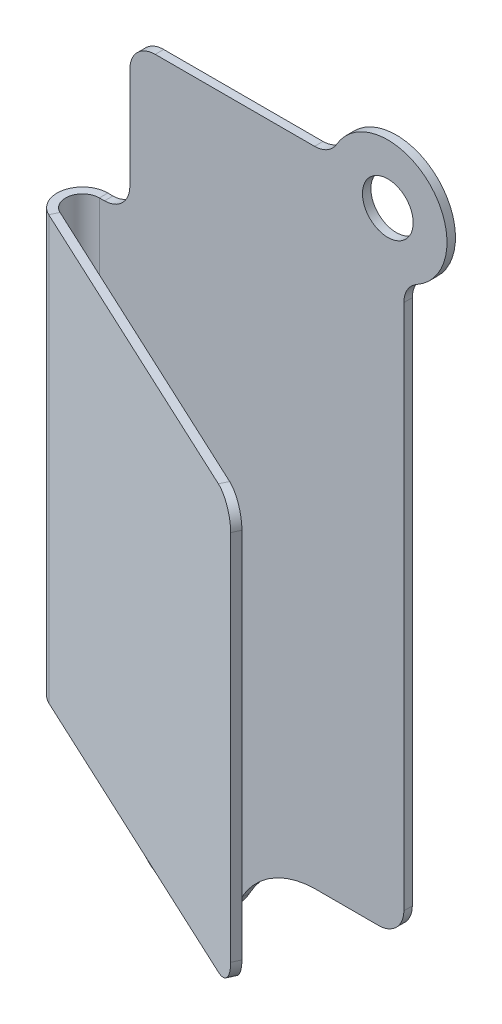
ISO-10303-21;
HEADER;
FILE_DESCRIPTION(('STEP AP214'),'2;1');
FILE_NAME('part.step','',(''),(''),'','','');
FILE_SCHEMA(('AUTOMOTIVE_DESIGN { 1 0 10303 214 1 1 1 1 }'));
ENDSEC;
DATA;
#1=APPLICATION_CONTEXT('core data for automotive mechanical design processes');
#2=APPLICATION_PROTOCOL_DEFINITION('international standard','automotive_design',2000,#1);
#3=PRODUCT_CONTEXT('',#1,'mechanical');
#4=PRODUCT('Part','Part','',(#3));
#5=PRODUCT_RELATED_PRODUCT_CATEGORY('part','',(#4));
#6=PRODUCT_DEFINITION_FORMATION('','',#4);
#7=PRODUCT_DEFINITION_CONTEXT('part definition',#1,'design');
#8=PRODUCT_DEFINITION('design','',#6,#7);
#9=PRODUCT_DEFINITION_SHAPE('','',#8);
#10=(LENGTH_UNIT() NAMED_UNIT(*) SI_UNIT(.MILLI.,.METRE.));
#11=(NAMED_UNIT(*) PLANE_ANGLE_UNIT() SI_UNIT($,.RADIAN.));
#12=(NAMED_UNIT(*) SI_UNIT($,.STERADIAN.) SOLID_ANGLE_UNIT());
#13=UNCERTAINTY_MEASURE_WITH_UNIT(LENGTH_MEASURE(1.E-05),#10,'distance_accuracy_value','');
#14=(GEOMETRIC_REPRESENTATION_CONTEXT(3) GLOBAL_UNCERTAINTY_ASSIGNED_CONTEXT((#13)) GLOBAL_UNIT_ASSIGNED_CONTEXT((#10,
#11,#12)) REPRESENTATION_CONTEXT('',''));
#15=CARTESIAN_POINT('',(0.,0.,0.));
#16=DIRECTION('',(0.,0.,1.));
#17=DIRECTION('',(1.,0.,0.));
#18=AXIS2_PLACEMENT_3D('',#15,#16,#17);
#19=CARTESIAN_POINT('',(23.5,76.,0.));
#20=DIRECTION('',(0.,0.,1.));
#21=DIRECTION('',(1.,0.,0.));
#22=AXIS2_PLACEMENT_3D('',#19,#20,#21);
#23=CYLINDRICAL_SURFACE('',#22,7.);
#24=CARTESIAN_POINT('',(23.5,76.,1.));
#25=DIRECTION('',(0.,0.,1.));
#26=DIRECTION('',(1.,0.,0.));
#27=AXIS2_PLACEMENT_3D('',#24,#25,#26);
#28=CIRCLE('',#27,7.);
#29=CARTESIAN_POINT('',(26.93,69.8979429697847,1.));
#30=VERTEX_POINT('',#29);
#31=CARTESIAN_POINT('',(17.4378221735089,79.5,1.));
#32=VERTEX_POINT('',#31);
#33=EDGE_CURVE('E329',#30,#32,#28,.T.);
#34=ORIENTED_EDGE('',*,*,#33,.F.);
#35=DIRECTION('',(0.,0.,1.));
#36=VECTOR('',#35,1.);
#37=CARTESIAN_POINT('',(26.93,69.8979429697847,0.));
#38=LINE('',#37,#36);
#39=CARTESIAN_POINT('',(26.93,69.8979429697847,0.));
#40=VERTEX_POINT('',#39);
#41=EDGE_CURVE('E387',#30,#40,#38,.F.);
#42=ORIENTED_EDGE('',*,*,#41,.T.);
#43=CARTESIAN_POINT('',(23.5,76.,0.));
#44=DIRECTION('',(0.,0.,1.));
#45=DIRECTION('',(1.,0.,0.));
#46=AXIS2_PLACEMENT_3D('',#43,#44,#45);
#47=CIRCLE('',#46,7.);
#48=CARTESIAN_POINT('',(17.4378221735089,79.5,0.));
#49=VERTEX_POINT('',#48);
#50=EDGE_CURVE('E284',#40,#49,#47,.T.);
#51=ORIENTED_EDGE('',*,*,#50,.T.);
#52=DIRECTION('',(0.,0.,1.));
#53=VECTOR('',#52,1.);
#54=CARTESIAN_POINT('',(17.4378221735089,79.5,0.));
#55=LINE('',#54,#53);
#56=EDGE_CURVE('E385',#49,#32,#55,.T.);
#57=ORIENTED_EDGE('',*,*,#56,.T.);
#58=EDGE_LOOP('',(#34,#42,#51,#57));
#59=FACE_BOUND('',#58,.T.);
#60=ADVANCED_FACE('F62',(#59),#23,.T.);
#61=CARTESIAN_POINT('',(25.4,2.,0.));
#62=DIRECTION('',(1.,0.,0.));
#63=DIRECTION('',(0.,1.,0.));
#64=AXIS2_PLACEMENT_3D('',#61,#62,#63);
#65=PLANE('',#64);
#66=DIRECTION('',(0.,1.,0.));
#67=VECTOR('',#66,1.);
#68=CARTESIAN_POINT('',(25.4,76.,1.));
#69=LINE('',#68,#67);
#70=CARTESIAN_POINT('',(25.4,5.,1.));
#71=VERTEX_POINT('',#70);
#72=CARTESIAN_POINT('',(25.4,67.282775671121,1.));
#73=VERTEX_POINT('',#72);
#74=EDGE_CURVE('E326',#71,#73,#69,.T.);
#75=ORIENTED_EDGE('',*,*,#74,.F.);
#76=DIRECTION('',(0.,0.,-1.));
#77=VECTOR('',#76,1.);
#78=CARTESIAN_POINT('',(25.4,5.,0.));
#79=LINE('',#78,#77);
#80=CARTESIAN_POINT('',(25.4,5.,0.));
#81=VERTEX_POINT('',#80);
#82=EDGE_CURVE('E370',#71,#81,#79,.T.);
#83=ORIENTED_EDGE('',*,*,#82,.T.);
#84=DIRECTION('',(0.,1.,0.));
#85=VECTOR('',#84,1.);
#86=CARTESIAN_POINT('',(25.4,2.,0.));
#87=LINE('',#86,#85);
#88=CARTESIAN_POINT('',(25.4,67.282775671121,0.));
#89=VERTEX_POINT('',#88);
#90=EDGE_CURVE('E287',#81,#89,#87,.T.);
#91=ORIENTED_EDGE('',*,*,#90,.T.);
#92=DIRECTION('',(0.,0.,-1.));
#93=VECTOR('',#92,1.);
#94=CARTESIAN_POINT('',(25.4,67.282775671121,1.));
#95=LINE('',#94,#93);
#96=EDGE_CURVE('E368',#89,#73,#95,.F.);
#97=ORIENTED_EDGE('',*,*,#96,.T.);
#98=EDGE_LOOP('',(#75,#83,#91,#97));
#99=FACE_BOUND('',#98,.T.);
#100=ADVANCED_FACE('F442',(#99),#65,.T.);
#101=CARTESIAN_POINT('',(6.70820393249938,2.,0.));
#102=DIRECTION('',(0.,-1.,0.));
#103=DIRECTION('',(1.,0.,0.));
#104=AXIS2_PLACEMENT_3D('',#101,#102,#103);
#105=PLANE('',#104);
#106=DIRECTION('',(1.,0.,0.));
#107=VECTOR('',#106,1.);
#108=CARTESIAN_POINT('',(23.5,2.,1.));
#109=LINE('',#108,#107);
#110=CARTESIAN_POINT('',(15.,2.,1.));
#111=VERTEX_POINT('',#110);
#112=CARTESIAN_POINT('',(22.4,2.,1.));
#113=VERTEX_POINT('',#112);
#114=EDGE_CURVE('E324',#111,#113,#109,.T.);
#115=ORIENTED_EDGE('',*,*,#114,.F.);
#116=DIRECTION('',(0.,0.,-1.));
#117=VECTOR('',#116,1.);
#118=CARTESIAN_POINT('',(15.,2.,0.));
#119=LINE('',#118,#117);
#120=CARTESIAN_POINT('',(15.,2.,0.));
#121=VERTEX_POINT('',#120);
#122=EDGE_CURVE('E419',#111,#121,#119,.T.);
#123=ORIENTED_EDGE('',*,*,#122,.T.);
#124=DIRECTION('',(1.,0.,0.));
#125=VECTOR('',#124,1.);
#126=CARTESIAN_POINT('',(6.70820393249938,2.,0.));
#127=LINE('',#126,#125);
#128=CARTESIAN_POINT('',(22.4,2.,0.));
#129=VERTEX_POINT('',#128);
#130=EDGE_CURVE('E290',#121,#129,#127,.T.);
#131=ORIENTED_EDGE('',*,*,#130,.T.);
#132=DIRECTION('',(0.,0.,-1.));
#133=VECTOR('',#132,1.);
#134=CARTESIAN_POINT('',(22.4,2.,0.));
#135=LINE('',#134,#133);
#136=EDGE_CURVE('E378',#129,#113,#135,.F.);
#137=ORIENTED_EDGE('',*,*,#136,.T.);
#138=EDGE_LOOP('',(#115,#123,#131,#137));
#139=FACE_BOUND('',#138,.T.);
#140=ADVANCED_FACE('F425',(#139),#105,.T.);
#141=CARTESIAN_POINT('',(0.,0.,0.));
#142=DIRECTION('',(0.,0.,1.));
#143=DIRECTION('',(1.,0.,0.));
#144=AXIS2_PLACEMENT_3D('',#141,#142,#143);
#145=CYLINDRICAL_SURFACE('',#144,7.00000000000001);
#146=CARTESIAN_POINT('',(0.,0.,0.));
#147=DIRECTION('',(0.,0.,1.));
#148=DIRECTION('',(1.,0.,0.));
#149=AXIS2_PLACEMENT_3D('',#146,#147,#148);
#150=CIRCLE('',#149,7.00000000000001);
#151=CARTESIAN_POINT('',(-7.00000000000001,0.,0.));
#152=VERTEX_POINT('',#151);
#153=CARTESIAN_POINT('',(6.1764705882353,-3.29411764705883,0.));
#154=VERTEX_POINT('',#153);
#155=EDGE_CURVE('E292',#152,#154,#150,.T.);
#156=ORIENTED_EDGE('',*,*,#155,.T.);
#157=DIRECTION('',(0.,0.,1.));
#158=VECTOR('',#157,1.);
#159=CARTESIAN_POINT('',(6.1764705882353,-3.29411764705883,0.));
#160=LINE('',#159,#158);
#161=CARTESIAN_POINT('',(6.1764705882353,-3.29411764705883,1.));
#162=VERTEX_POINT('',#161);
#163=EDGE_CURVE('E83',#154,#162,#160,.T.);
#164=ORIENTED_EDGE('',*,*,#163,.T.);
#165=CARTESIAN_POINT('',(0.,0.,1.));
#166=DIRECTION('',(0.,0.,1.));
#167=DIRECTION('',(1.,0.,0.));
#168=AXIS2_PLACEMENT_3D('',#165,#166,#167);
#169=CIRCLE('',#168,7.00000000000001);
#170=CARTESIAN_POINT('',(-7.00000000000001,0.,1.));
#171=VERTEX_POINT('',#170);
#172=EDGE_CURVE('E322',#171,#162,#169,.T.);
#173=ORIENTED_EDGE('',*,*,#172,.F.);
#174=DIRECTION('',(0.,0.,-1.));
#175=VECTOR('',#174,1.);
#176=CARTESIAN_POINT('',(-7.00000000000001,0.,0.));
#177=LINE('',#176,#175);
#178=EDGE_CURVE('E343',#171,#152,#177,.T.);
#179=ORIENTED_EDGE('',*,*,#178,.T.);
#180=EDGE_LOOP('',(#156,#164,#173,#179));
#181=FACE_BOUND('',#180,.T.);
#182=ADVANCED_FACE('F557',(#181),#145,.T.);
#183=CARTESIAN_POINT('',(-7.00000000000001,0.,0.));
#184=DIRECTION('',(-1.,0.,0.));
#185=DIRECTION('',(0.,-1.,0.));
#186=AXIS2_PLACEMENT_3D('',#183,#184,#185);
#187=PLANE('',#186);
#188=DIRECTION('',(0.,1.,0.));
#189=VECTOR('',#188,1.);
#190=CARTESIAN_POINT('',(-7.00000000000001,76.,1.));
#191=LINE('',#190,#189);
#192=CARTESIAN_POINT('',(-7.00000000000001,6.99999999999999,1.));
#193=VERTEX_POINT('',#192);
#194=EDGE_CURVE('E320',#193,#171,#191,.F.);
#195=ORIENTED_EDGE('',*,*,#194,.F.);
#196=DIRECTION('',(0.,0.,-1.));
#197=VECTOR('',#196,1.);
#198=CARTESIAN_POINT('',(-7.00000000000001,6.99999999999999,0.));
#199=LINE('',#198,#197);
#200=CARTESIAN_POINT('',(-7.00000000000001,6.99999999999999,0.));
#201=VERTEX_POINT('',#200);
#202=EDGE_CURVE('E363',#193,#201,#199,.T.);
#203=ORIENTED_EDGE('',*,*,#202,.T.);
#204=DIRECTION('',(0.,-1.,0.));
#205=VECTOR('',#204,1.);
#206=CARTESIAN_POINT('',(-7.00000000000001,0.,0.));
#207=LINE('',#206,#205);
#208=EDGE_CURVE('E294',#201,#152,#207,.T.);
#209=ORIENTED_EDGE('',*,*,#208,.T.);
#210=ORIENTED_EDGE('',*,*,#178,.F.);
#211=EDGE_LOOP('',(#195,#203,#209,#210));
#212=FACE_BOUND('',#211,.T.);
#213=ADVANCED_FACE('F553',(#212),#187,.T.);
#214=CARTESIAN_POINT('',(-10.6,9.99999999999999,0.));
#215=DIRECTION('',(0.,-1.,0.));
#216=DIRECTION('',(1.,0.,0.));
#217=AXIS2_PLACEMENT_3D('',#214,#215,#216);
#218=PLANE('',#217);
#219=DIRECTION('',(1.,0.,0.));
#220=VECTOR('',#219,1.);
#221=CARTESIAN_POINT('',(-10.6,9.99999999999999,0.));
#222=LINE('',#221,#220);
#223=CARTESIAN_POINT('',(-10.6,10.,0.));
#224=VERTEX_POINT('',#223);
#225=CARTESIAN_POINT('',(-10.,9.99999999999999,0.));
#226=VERTEX_POINT('',#225);
#227=EDGE_CURVE('E296',#224,#226,#222,.T.);
#228=ORIENTED_EDGE('',*,*,#227,.T.);
#229=DIRECTION('',(0.,0.,-1.));
#230=VECTOR('',#229,1.);
#231=CARTESIAN_POINT('',(-10.,9.99999999999999,1.));
#232=LINE('',#231,#230);
#233=CARTESIAN_POINT('',(-10.,9.99999999999999,1.));
#234=VERTEX_POINT('',#233);
#235=EDGE_CURVE('E366',#226,#234,#232,.F.);
#236=ORIENTED_EDGE('',*,*,#235,.T.);
#237=DIRECTION('',(1.,0.,0.));
#238=VECTOR('',#237,1.);
#239=CARTESIAN_POINT('',(23.5,9.99999999999999,1.));
#240=LINE('',#239,#238);
#241=CARTESIAN_POINT('',(-10.6,9.99999999999999,1.));
#242=VERTEX_POINT('',#241);
#243=EDGE_CURVE('E317',#242,#234,#240,.T.);
#244=ORIENTED_EDGE('',*,*,#243,.F.);
#245=DIRECTION('',(0.,0.,-1.));
#246=VECTOR('',#245,1.);
#247=CARTESIAN_POINT('',(-10.6,9.99999999999999,0.));
#248=LINE('',#247,#246);
#249=EDGE_CURVE('E340',#242,#224,#248,.T.);
#250=ORIENTED_EDGE('',*,*,#249,.T.);
#251=EDGE_LOOP('',(#228,#236,#244,#250));
#252=FACE_BOUND('',#251,.T.);
#253=ADVANCED_FACE('F550',(#252),#218,.T.);
#254=CARTESIAN_POINT('',(-7.,60.,0.));
#255=DIRECTION('',(0.,1.,0.));
#256=DIRECTION('',(-1.,0.,0.));
#257=AXIS2_PLACEMENT_3D('',#254,#255,#256);
#258=PLANE('',#257);
#259=DIRECTION('',(1.,0.,0.));
#260=VECTOR('',#259,1.);
#261=CARTESIAN_POINT('',(23.5,60.,1.));
#262=LINE('',#261,#260);
#263=CARTESIAN_POINT('',(-10.,60.,1.));
#264=VERTEX_POINT('',#263);
#265=CARTESIAN_POINT('',(-10.6,60.,1.));
#266=VERTEX_POINT('',#265);
#267=EDGE_CURVE('E312',#264,#266,#262,.F.);
#268=ORIENTED_EDGE('',*,*,#267,.F.);
#269=DIRECTION('',(0.,0.,-1.));
#270=VECTOR('',#269,1.);
#271=CARTESIAN_POINT('',(-10.,60.,0.));
#272=LINE('',#271,#270);
#273=CARTESIAN_POINT('',(-10.,60.,0.));
#274=VERTEX_POINT('',#273);
#275=EDGE_CURVE('E395',#264,#274,#272,.T.);
#276=ORIENTED_EDGE('',*,*,#275,.T.);
#277=DIRECTION('',(-1.,0.,0.));
#278=VECTOR('',#277,1.);
#279=CARTESIAN_POINT('',(-7.,60.,0.));
#280=LINE('',#279,#278);
#281=CARTESIAN_POINT('',(-10.6,60.,0.));
#282=VERTEX_POINT('',#281);
#283=EDGE_CURVE('E300',#274,#282,#280,.T.);
#284=ORIENTED_EDGE('',*,*,#283,.T.);
#285=DIRECTION('',(0.,0.,-1.));
#286=VECTOR('',#285,1.);
#287=CARTESIAN_POINT('',(-10.6,60.,0.));
#288=LINE('',#287,#286);
#289=EDGE_CURVE('E308',#266,#282,#288,.T.);
#290=ORIENTED_EDGE('',*,*,#289,.F.);
#291=EDGE_LOOP('',(#268,#276,#284,#290));
#292=FACE_BOUND('',#291,.T.);
#293=ADVANCED_FACE('F476',(#292),#258,.T.);
#294=CARTESIAN_POINT('',(-7.,60.,0.));
#295=DIRECTION('',(-1.,0.,0.));
#296=DIRECTION('',(0.,-1.,0.));
#297=AXIS2_PLACEMENT_3D('',#294,#295,#296);
#298=PLANE('',#297);
#299=DIRECTION('',(0.,-1.,0.));
#300=VECTOR('',#299,1.);
#301=CARTESIAN_POINT('',(-7.,60.,0.));
#302=LINE('',#301,#300);
#303=CARTESIAN_POINT('',(-7.,75.,0.));
#304=VERTEX_POINT('',#303);
#305=CARTESIAN_POINT('',(-7.,63.,0.));
#306=VERTEX_POINT('',#305);
#307=EDGE_CURVE('E277',#304,#306,#302,.T.);
#308=ORIENTED_EDGE('',*,*,#307,.T.);
#309=DIRECTION('',(0.,0.,-1.));
#310=VECTOR('',#309,1.);
#311=CARTESIAN_POINT('',(-7.,63.,1.));
#312=LINE('',#311,#310);
#313=CARTESIAN_POINT('',(-7.,63.,1.));
#314=VERTEX_POINT('',#313);
#315=EDGE_CURVE('E401',#306,#314,#312,.F.);
#316=ORIENTED_EDGE('',*,*,#315,.T.);
#317=DIRECTION('',(0.,1.,0.));
#318=VECTOR('',#317,1.);
#319=CARTESIAN_POINT('',(-7.,76.,1.));
#320=LINE('',#319,#318);
#321=CARTESIAN_POINT('',(-7.,75.,1.));
#322=VERTEX_POINT('',#321);
#323=EDGE_CURVE('E272',#322,#314,#320,.F.);
#324=ORIENTED_EDGE('',*,*,#323,.F.);
#325=DIRECTION('',(0.,0.,-1.));
#326=VECTOR('',#325,1.);
#327=CARTESIAN_POINT('',(-7.,75.,0.));
#328=LINE('',#327,#326);
#329=EDGE_CURVE('E398',#322,#304,#328,.T.);
#330=ORIENTED_EDGE('',*,*,#329,.T.);
#331=EDGE_LOOP('',(#308,#316,#324,#330));
#332=FACE_BOUND('',#331,.T.);
#333=ADVANCED_FACE('F467',(#332),#298,.T.);
#334=CARTESIAN_POINT('',(-7.,78.,0.));
#335=DIRECTION('',(0.,1.,0.));
#336=DIRECTION('',(-1.,0.,0.));
#337=AXIS2_PLACEMENT_3D('',#334,#335,#336);
#338=PLANE('',#337);
#339=DIRECTION('',(1.,0.,0.));
#340=VECTOR('',#339,1.);
#341=CARTESIAN_POINT('',(23.5,78.,1.));
#342=LINE('',#341,#340);
#343=CARTESIAN_POINT('',(14.8397459621556,78.,1.));
#344=VERTEX_POINT('',#343);
#345=CARTESIAN_POINT('',(-4.,78.,1.));
#346=VERTEX_POINT('',#345);
#347=EDGE_CURVE('E311',#344,#346,#342,.F.);
#348=ORIENTED_EDGE('',*,*,#347,.F.);
#349=DIRECTION('',(0.,0.,-1.));
#350=VECTOR('',#349,1.);
#351=CARTESIAN_POINT('',(14.8397459621556,78.,0.));
#352=LINE('',#351,#350);
#353=CARTESIAN_POINT('',(14.8397459621556,78.,0.));
#354=VERTEX_POINT('',#353);
#355=EDGE_CURVE('E392',#344,#354,#352,.T.);
#356=ORIENTED_EDGE('',*,*,#355,.T.);
#357=DIRECTION('',(-1.,0.,0.));
#358=VECTOR('',#357,1.);
#359=CARTESIAN_POINT('',(-7.,78.,0.));
#360=LINE('',#359,#358);
#361=CARTESIAN_POINT('',(-4.,78.,0.));
#362=VERTEX_POINT('',#361);
#363=EDGE_CURVE('E280',#354,#362,#360,.T.);
#364=ORIENTED_EDGE('',*,*,#363,.T.);
#365=DIRECTION('',(0.,0.,-1.));
#366=VECTOR('',#365,1.);
#367=CARTESIAN_POINT('',(-4.,78.,0.));
#368=LINE('',#367,#366);
#369=EDGE_CURVE('E390',#362,#346,#368,.F.);
#370=ORIENTED_EDGE('',*,*,#369,.T.);
#371=EDGE_LOOP('',(#348,#356,#364,#370));
#372=FACE_BOUND('',#371,.T.);
#373=ADVANCED_FACE('F458',(#372),#338,.T.);
#374=CARTESIAN_POINT('',(0.,0.,0.));
#375=DIRECTION('',(0.,0.,1.));
#376=DIRECTION('',(1.,0.,0.));
#377=AXIS2_PLACEMENT_3D('',#374,#375,#376);
#378=CYLINDRICAL_SURFACE('',#377,3.);
#379=CARTESIAN_POINT('',(0.,0.,0.));
#380=DIRECTION('',(0.,0.,1.));
#381=DIRECTION('',(1.,0.,0.));
#382=AXIS2_PLACEMENT_3D('',#379,#380,#381);
#383=CIRCLE('',#382,3.);
#384=CARTESIAN_POINT('',(3.,0.,0.));
#385=VERTEX_POINT('',#384);
#386=EDGE_CURVE('E302',#385,#385,#383,.T.);
#387=ORIENTED_EDGE('',*,*,#386,.F.);
#388=EDGE_LOOP('',(#387));
#389=FACE_BOUND('',#388,.T.);
#390=CARTESIAN_POINT('',(0.,0.,1.));
#391=DIRECTION('',(0.,0.,1.));
#392=DIRECTION('',(1.,0.,0.));
#393=AXIS2_PLACEMENT_3D('',#390,#391,#392);
#394=CIRCLE('',#393,3.);
#395=CARTESIAN_POINT('',(3.,0.,1.));
#396=VERTEX_POINT('',#395);
#397=EDGE_CURVE('E314',#396,#396,#394,.T.);
#398=ORIENTED_EDGE('',*,*,#397,.T.);
#399=EDGE_LOOP('',(#398));
#400=FACE_BOUND('',#399,.T.);
#401=ADVANCED_FACE('F524',(#389,#400),#378,.F.);
#402=CARTESIAN_POINT('',(23.5,76.,0.));
#403=DIRECTION('',(0.,0.,1.));
#404=DIRECTION('',(1.,0.,0.));
#405=AXIS2_PLACEMENT_3D('',#402,#403,#404);
#406=CYLINDRICAL_SURFACE('',#405,3.);
#407=CARTESIAN_POINT('',(23.5,76.,0.));
#408=DIRECTION('',(0.,0.,1.));
#409=DIRECTION('',(1.,0.,0.));
#410=AXIS2_PLACEMENT_3D('',#407,#408,#409);
#411=CIRCLE('',#410,3.);
#412=CARTESIAN_POINT('',(26.5,76.,0.));
#413=VERTEX_POINT('',#412);
#414=EDGE_CURVE('E305',#413,#413,#411,.T.);
#415=ORIENTED_EDGE('',*,*,#414,.F.);
#416=EDGE_LOOP('',(#415));
#417=FACE_BOUND('',#416,.T.);
#418=CARTESIAN_POINT('',(23.5,76.,1.));
#419=DIRECTION('',(0.,0.,1.));
#420=DIRECTION('',(1.,0.,0.));
#421=AXIS2_PLACEMENT_3D('',#418,#419,#420);
#422=CIRCLE('',#421,3.);
#423=CARTESIAN_POINT('',(26.5,76.,1.));
#424=VERTEX_POINT('',#423);
#425=EDGE_CURVE('E281',#424,#424,#422,.T.);
#426=ORIENTED_EDGE('',*,*,#425,.T.);
#427=EDGE_LOOP('',(#426));
#428=FACE_BOUND('',#427,.T.);
#429=ADVANCED_FACE('F526',(#417,#428),#406,.F.);
#430=CARTESIAN_POINT('',(23.5,76.,0.));
#431=DIRECTION('',(0.,0.,1.));
#432=DIRECTION('',(1.,0.,0.));
#433=AXIS2_PLACEMENT_3D('',#430,#431,#432);
#434=PLANE('',#433);
#435=ORIENTED_EDGE('',*,*,#90,.F.);
#436=CARTESIAN_POINT('',(22.4,5.,0.));
#437=DIRECTION('',(0.,0.,1.));
#438=DIRECTION('',(1.,0.,0.));
#439=AXIS2_PLACEMENT_3D('',#436,#437,#438);
#440=CIRCLE('',#439,3.);
#441=EDGE_CURVE('E375',#81,#129,#440,.F.);
#442=ORIENTED_EDGE('',*,*,#441,.T.);
#443=ORIENTED_EDGE('',*,*,#130,.F.);
#444=CARTESIAN_POINT('',(15.,-8.,0.));
#445=DIRECTION('',(0.,0.,1.));
#446=DIRECTION('',(1.,0.,0.));
#447=AXIS2_PLACEMENT_3D('',#444,#445,#446);
#448=CIRCLE('',#447,10.);
#449=EDGE_CURVE('E70',#121,#154,#448,.T.);
#450=ORIENTED_EDGE('',*,*,#449,.T.);
#451=ORIENTED_EDGE('',*,*,#155,.F.);
#452=ORIENTED_EDGE('',*,*,#208,.F.);
#453=CARTESIAN_POINT('',(-10.,6.99999999999999,0.));
#454=DIRECTION('',(0.,0.,1.));
#455=DIRECTION('',(1.,0.,0.));
#456=AXIS2_PLACEMENT_3D('',#453,#454,#455);
#457=CIRCLE('',#456,3.);
#458=EDGE_CURVE('E403',#201,#226,#457,.T.);
#459=ORIENTED_EDGE('',*,*,#458,.T.);
#460=ORIENTED_EDGE('',*,*,#227,.F.);
#461=DIRECTION('',(0.,-1.,0.));
#462=VECTOR('',#461,1.);
#463=CARTESIAN_POINT('',(-10.6,60.,0.));
#464=LINE('',#463,#462);
#465=EDGE_CURVE('E226',#282,#224,#464,.T.);
#466=ORIENTED_EDGE('',*,*,#465,.F.);
#467=ORIENTED_EDGE('',*,*,#283,.F.);
#468=CARTESIAN_POINT('',(-10.,63.,0.));
#469=DIRECTION('',(0.,0.,1.));
#470=DIRECTION('',(1.,0.,0.));
#471=AXIS2_PLACEMENT_3D('',#468,#469,#470);
#472=CIRCLE('',#471,3.);
#473=EDGE_CURVE('E415',#274,#306,#472,.T.);
#474=ORIENTED_EDGE('',*,*,#473,.T.);
#475=ORIENTED_EDGE('',*,*,#307,.F.);
#476=CARTESIAN_POINT('',(-4.,75.,0.));
#477=DIRECTION('',(0.,0.,1.));
#478=DIRECTION('',(1.,0.,0.));
#479=AXIS2_PLACEMENT_3D('',#476,#477,#478);
#480=CIRCLE('',#479,3.);
#481=EDGE_CURVE('E373',#304,#362,#480,.F.);
#482=ORIENTED_EDGE('',*,*,#481,.T.);
#483=ORIENTED_EDGE('',*,*,#363,.F.);
#484=CARTESIAN_POINT('',(14.8397459621556,81.,0.));
#485=DIRECTION('',(0.,0.,1.));
#486=DIRECTION('',(1.,0.,0.));
#487=AXIS2_PLACEMENT_3D('',#484,#485,#486);
#488=CIRCLE('',#487,3.);
#489=EDGE_CURVE('E411',#354,#49,#488,.T.);
#490=ORIENTED_EDGE('',*,*,#489,.T.);
#491=ORIENTED_EDGE('',*,*,#50,.F.);
#492=CARTESIAN_POINT('',(28.4,67.282775671121,0.));
#493=DIRECTION('',(0.,0.,1.));
#494=DIRECTION('',(1.,0.,0.));
#495=AXIS2_PLACEMENT_3D('',#492,#493,#494);
#496=CIRCLE('',#495,3.);
#497=EDGE_CURVE('E407',#40,#89,#496,.T.);
#498=ORIENTED_EDGE('',*,*,#497,.T.);
#499=EDGE_LOOP('',(#435,#442,#443,#450,#451,#452,#459,#460,#466,#467,#474,#475,#482,#483,#490,
#491,#498));
#500=FACE_BOUND('',#499,.T.);
#501=ORIENTED_EDGE('',*,*,#386,.T.);
#502=EDGE_LOOP('',(#501));
#503=FACE_BOUND('',#502,.T.);
#504=ORIENTED_EDGE('',*,*,#414,.T.);
#505=EDGE_LOOP('',(#504));
#506=FACE_BOUND('',#505,.T.);
#507=ADVANCED_FACE('F429',(#500,#503,#506),#434,.F.);
#508=CARTESIAN_POINT('',(23.5,76.,1.));
#509=DIRECTION('',(0.,0.,1.));
#510=DIRECTION('',(1.,0.,0.));
#511=AXIS2_PLACEMENT_3D('',#508,#509,#510);
#512=PLANE('',#511);
#513=ORIENTED_EDGE('',*,*,#172,.T.);
#514=CARTESIAN_POINT('',(15.,-8.,1.));
#515=DIRECTION('',(0.,0.,1.));
#516=DIRECTION('',(1.,0.,0.));
#517=AXIS2_PLACEMENT_3D('',#514,#515,#516);
#518=CIRCLE('',#517,10.);
#519=EDGE_CURVE('E13',#162,#111,#518,.F.);
#520=ORIENTED_EDGE('',*,*,#519,.T.);
#521=ORIENTED_EDGE('',*,*,#114,.T.);
#522=CARTESIAN_POINT('',(22.4,5.,1.));
#523=DIRECTION('',(0.,0.,1.));
#524=DIRECTION('',(1.,0.,0.));
#525=AXIS2_PLACEMENT_3D('',#522,#523,#524);
#526=CIRCLE('',#525,3.);
#527=EDGE_CURVE('E383',#113,#71,#526,.T.);
#528=ORIENTED_EDGE('',*,*,#527,.T.);
#529=ORIENTED_EDGE('',*,*,#74,.T.);
#530=CARTESIAN_POINT('',(28.4,67.282775671121,1.));
#531=DIRECTION('',(0.,0.,1.));
#532=DIRECTION('',(1.,0.,0.));
#533=AXIS2_PLACEMENT_3D('',#530,#531,#532);
#534=CIRCLE('',#533,3.);
#535=EDGE_CURVE('E409',#73,#30,#534,.F.);
#536=ORIENTED_EDGE('',*,*,#535,.T.);
#537=ORIENTED_EDGE('',*,*,#33,.T.);
#538=CARTESIAN_POINT('',(14.8397459621556,81.,1.));
#539=DIRECTION('',(0.,0.,1.));
#540=DIRECTION('',(1.,0.,0.));
#541=AXIS2_PLACEMENT_3D('',#538,#539,#540);
#542=CIRCLE('',#541,3.);
#543=EDGE_CURVE('E413',#32,#344,#542,.F.);
#544=ORIENTED_EDGE('',*,*,#543,.T.);
#545=ORIENTED_EDGE('',*,*,#347,.T.);
#546=CARTESIAN_POINT('',(-4.,75.,1.));
#547=DIRECTION('',(0.,0.,1.));
#548=DIRECTION('',(1.,0.,0.));
#549=AXIS2_PLACEMENT_3D('',#546,#547,#548);
#550=CIRCLE('',#549,3.);
#551=EDGE_CURVE('E381',#346,#322,#550,.T.);
#552=ORIENTED_EDGE('',*,*,#551,.T.);
#553=ORIENTED_EDGE('',*,*,#323,.T.);
#554=CARTESIAN_POINT('',(-10.,63.,1.));
#555=DIRECTION('',(0.,0.,1.));
#556=DIRECTION('',(1.,0.,0.));
#557=AXIS2_PLACEMENT_3D('',#554,#555,#556);
#558=CIRCLE('',#557,3.);
#559=EDGE_CURVE('E417',#314,#264,#558,.F.);
#560=ORIENTED_EDGE('',*,*,#559,.T.);
#561=ORIENTED_EDGE('',*,*,#267,.T.);
#562=DIRECTION('',(0.,1.,0.));
#563=VECTOR('',#562,1.);
#564=CARTESIAN_POINT('',(-10.6,76.,1.));
#565=LINE('',#564,#563);
#566=EDGE_CURVE('E315',#266,#242,#565,.F.);
#567=ORIENTED_EDGE('',*,*,#566,.T.);
#568=ORIENTED_EDGE('',*,*,#243,.T.);
#569=CARTESIAN_POINT('',(-10.,6.99999999999999,1.));
#570=DIRECTION('',(0.,0.,1.));
#571=DIRECTION('',(1.,0.,0.));
#572=AXIS2_PLACEMENT_3D('',#569,#570,#571);
#573=CIRCLE('',#572,3.);
#574=EDGE_CURVE('E405',#234,#193,#573,.F.);
#575=ORIENTED_EDGE('',*,*,#574,.T.);
#576=ORIENTED_EDGE('',*,*,#194,.T.);
#577=EDGE_LOOP('',(#513,#520,#521,#528,#529,#536,#537,#544,#545,#552,#553,#560,#561,#567,#568,
#575,#576));
#578=FACE_BOUND('',#577,.T.);
#579=ORIENTED_EDGE('',*,*,#397,.F.);
#580=EDGE_LOOP('',(#579));
#581=FACE_BOUND('',#580,.T.);
#582=ORIENTED_EDGE('',*,*,#425,.F.);
#583=EDGE_LOOP('',(#582));
#584=FACE_BOUND('',#583,.T.);
#585=ADVANCED_FACE('F438',(#578,#581,#584),#512,.T.);
#586=CARTESIAN_POINT('',(-10.6,60.,3.));
#587=DIRECTION('',(0.,1.,0.));
#588=DIRECTION('',(0.,0.,1.));
#589=AXIS2_PLACEMENT_3D('',#586,#587,#588);
#590=PLANE('',#589);
#591=DIRECTION('',(0.422618261740701,0.,-0.906307787036649));
#592=VECTOR('',#591,1.);
#593=CARTESIAN_POINT('',(-11.8678547852221,60.,5.71892336110995));
#594=LINE('',#593,#592);
#595=CARTESIAN_POINT('',(-11.4452365234814,60.,4.8126155740733));
#596=VERTEX_POINT('',#595);
#597=CARTESIAN_POINT('',(-11.8678547852221,60.,5.71892336110995));
#598=VERTEX_POINT('',#597);
#599=EDGE_CURVE('E269',#596,#598,#594,.F.);
#600=ORIENTED_EDGE('',*,*,#599,.F.);
#601=CARTESIAN_POINT('',(-10.6,60.,3.));
#602=DIRECTION('',(0.,-1.,0.));
#603=DIRECTION('',(0.,0.,-1.));
#604=AXIS2_PLACEMENT_3D('',#601,#602,#603);
#605=CIRCLE('',#604,2.);
#606=EDGE_CURVE('E230',#266,#596,#605,.F.);
#607=ORIENTED_EDGE('',*,*,#606,.F.);
#608=ORIENTED_EDGE('',*,*,#289,.T.);
#609=CARTESIAN_POINT('',(-10.6,60.,3.));
#610=DIRECTION('',(0.,-1.,0.));
#611=DIRECTION('',(0.,0.,-1.));
#612=AXIS2_PLACEMENT_3D('',#609,#610,#611);
#613=CIRCLE('',#612,3.);
#614=EDGE_CURVE('E229',#282,#598,#613,.F.);
#615=ORIENTED_EDGE('',*,*,#614,.T.);
#616=EDGE_LOOP('',(#600,#607,#608,#615));
#617=FACE_BOUND('',#616,.T.);
#618=ADVANCED_FACE('F486',(#617),#590,.T.);
#619=CARTESIAN_POINT('',(-10.6,10.,3.));
#620=DIRECTION('',(0.,1.,0.));
#621=DIRECTION('',(0.,0.,1.));
#622=AXIS2_PLACEMENT_3D('',#619,#620,#621);
#623=PLANE('',#622);
#624=CARTESIAN_POINT('',(-10.6,10.,3.));
#625=DIRECTION('',(0.,-1.,0.));
#626=DIRECTION('',(0.,0.,-1.));
#627=AXIS2_PLACEMENT_3D('',#624,#625,#626);
#628=CIRCLE('',#627,2.);
#629=CARTESIAN_POINT('',(-11.4452365234814,10.,4.8126155740733));
#630=VERTEX_POINT('',#629);
#631=EDGE_CURVE('E237',#630,#242,#628,.T.);
#632=ORIENTED_EDGE('',*,*,#631,.F.);
#633=DIRECTION('',(0.422618261740701,0.,-0.906307787036649));
#634=VECTOR('',#633,1.);
#635=CARTESIAN_POINT('',(-11.4452365234814,9.99999999999999,4.8126155740733));
#636=LINE('',#635,#634);
#637=CARTESIAN_POINT('',(-11.8678547852221,10.,5.71892336110995));
#638=VERTEX_POINT('',#637);
#639=EDGE_CURVE('E234',#630,#638,#636,.F.);
#640=ORIENTED_EDGE('',*,*,#639,.T.);
#641=CARTESIAN_POINT('',(-10.6,10.,3.));
#642=DIRECTION('',(0.,-1.,0.));
#643=DIRECTION('',(0.,0.,-1.));
#644=AXIS2_PLACEMENT_3D('',#641,#642,#643);
#645=CIRCLE('',#644,3.);
#646=EDGE_CURVE('E218',#638,#224,#645,.T.);
#647=ORIENTED_EDGE('',*,*,#646,.T.);
#648=ORIENTED_EDGE('',*,*,#249,.F.);
#649=EDGE_LOOP('',(#632,#640,#647,#648));
#650=FACE_BOUND('',#649,.T.);
#651=ADVANCED_FACE('F235',(#650),#623,.F.);
#652=CARTESIAN_POINT('',(-10.6,9.99999999999999,3.));
#653=DIRECTION('',(0.,-1.,0.));
#654=DIRECTION('',(-0.422618261740701,0.,0.906307787036649));
#655=AXIS2_PLACEMENT_3D('',#652,#653,#654);
#656=CYLINDRICAL_SURFACE('',#655,3.);
#657=ORIENTED_EDGE('',*,*,#465,.T.);
#658=ORIENTED_EDGE('',*,*,#646,.F.);
#659=DIRECTION('',(0.,-1.,0.));
#660=VECTOR('',#659,1.);
#661=CARTESIAN_POINT('',(-11.8678547852221,60.,5.71892336110995));
#662=LINE('',#661,#660);
#663=EDGE_CURVE('E223',#638,#598,#662,.F.);
#664=ORIENTED_EDGE('',*,*,#663,.T.);
#665=ORIENTED_EDGE('',*,*,#614,.F.);
#666=EDGE_LOOP('',(#657,#658,#664,#665));
#667=FACE_BOUND('',#666,.T.);
#668=ADVANCED_FACE('F220',(#667),#656,.T.);
#669=CARTESIAN_POINT('',(-10.6,9.99999999999999,3.));
#670=DIRECTION('',(0.,-1.,0.));
#671=DIRECTION('',(-0.422618261740701,0.,0.906307787036649));
#672=AXIS2_PLACEMENT_3D('',#669,#670,#671);
#673=CYLINDRICAL_SURFACE('',#672,2.);
#674=ORIENTED_EDGE('',*,*,#566,.F.);
#675=ORIENTED_EDGE('',*,*,#606,.T.);
#676=DIRECTION('',(0.,-1.,0.));
#677=VECTOR('',#676,1.);
#678=CARTESIAN_POINT('',(-11.4452365234814,60.,4.8126155740733));
#679=LINE('',#678,#677);
#680=EDGE_CURVE('E242',#596,#630,#679,.T.);
#681=ORIENTED_EDGE('',*,*,#680,.T.);
#682=ORIENTED_EDGE('',*,*,#631,.T.);
#683=EDGE_LOOP('',(#674,#675,#681,#682));
#684=FACE_BOUND('',#683,.T.);
#685=ADVANCED_FACE('F482',(#684),#673,.F.);
#686=CARTESIAN_POINT('',(28.4337261371395,10.,24.5118591809606));
#687=DIRECTION('',(0.,1.,0.));
#688=DIRECTION('',(-1.,0.,0.));
#689=AXIS2_PLACEMENT_3D('',#686,#687,#688);
#690=PLANE('',#689);
#691=DIRECTION('',(-0.906307787036649,0.,-0.422618261740701));
#692=VECTOR('',#691,1.);
#693=CARTESIAN_POINT('',(28.8563443988802,10.,23.605551393924));
#694=LINE('',#693,#692);
#695=CARTESIAN_POINT('',(26.1374210377703,10.,22.3376966087019));
#696=VERTEX_POINT('',#695);
#697=EDGE_CURVE('E252',#630,#696,#694,.F.);
#698=ORIENTED_EDGE('',*,*,#697,.T.);
#699=DIRECTION('',(0.422618261740701,0.,-0.906307787036649));
#700=VECTOR('',#699,1.);
#701=CARTESIAN_POINT('',(25.7148027760296,10.,23.2440043957385));
#702=LINE('',#701,#700);
#703=CARTESIAN_POINT('',(25.7148027760296,10.,23.2440043957385));
#704=VERTEX_POINT('',#703);
#705=EDGE_CURVE('E256',#696,#704,#702,.F.);
#706=ORIENTED_EDGE('',*,*,#705,.T.);
#707=DIRECTION('',(0.906307787036649,0.,0.422618261740701));
#708=VECTOR('',#707,1.);
#709=CARTESIAN_POINT('',(-11.7202831592856,9.99999999999999,5.78773714041051));
#710=LINE('',#709,#708);
#711=EDGE_CURVE('E248',#638,#704,#710,.T.);
#712=ORIENTED_EDGE('',*,*,#711,.F.);
#713=ORIENTED_EDGE('',*,*,#639,.F.);
#714=EDGE_LOOP('',(#698,#706,#712,#713));
#715=FACE_BOUND('',#714,.T.);
#716=ADVANCED_FACE('F254',(#715),#690,.F.);
#717=CARTESIAN_POINT('',(-20.0440352690648,60.,1.90630778703665));
#718=DIRECTION('',(0.,-1.,0.));
#719=DIRECTION('',(1.,0.,0.));
#720=AXIS2_PLACEMENT_3D('',#717,#718,#719);
#721=PLANE('',#720);
#722=DIRECTION('',(-0.906307787036649,0.,-0.422618261740701));
#723=VECTOR('',#722,1.);
#724=CARTESIAN_POINT('',(-11.7202831592856,60.,5.78773714041051));
#725=LINE('',#724,#723);
#726=CARTESIAN_POINT('',(25.7148027760296,60.,23.2440043957385));
#727=VERTEX_POINT('',#726);
#728=EDGE_CURVE('E251',#727,#598,#725,.T.);
#729=ORIENTED_EDGE('',*,*,#728,.F.);
#730=DIRECTION('',(0.422618261740701,0.,-0.906307787036649));
#731=VECTOR('',#730,1.);
#732=CARTESIAN_POINT('',(25.7148027760296,60.,23.2440043957385));
#733=LINE('',#732,#731);
#734=CARTESIAN_POINT('',(26.1374210377703,60.,22.3376966087019));
#735=VERTEX_POINT('',#734);
#736=EDGE_CURVE('E346',#727,#735,#733,.T.);
#737=ORIENTED_EDGE('',*,*,#736,.T.);
#738=DIRECTION('',(0.906307787036649,0.,0.422618261740701));
#739=VECTOR('',#738,1.);
#740=CARTESIAN_POINT('',(-19.6214170073241,60.,1.));
#741=LINE('',#740,#739);
#742=EDGE_CURVE('E258',#735,#596,#741,.F.);
#743=ORIENTED_EDGE('',*,*,#742,.T.);
#744=ORIENTED_EDGE('',*,*,#599,.T.);
#745=EDGE_LOOP('',(#729,#737,#743,#744));
#746=FACE_BOUND('',#745,.T.);
#747=ADVANCED_FACE('F488',(#746),#721,.F.);
#748=CARTESIAN_POINT('',(-11.7202831592856,0.,5.78773714041051));
#749=DIRECTION('',(0.422618261740701,0.,-0.906307787036649));
#750=DIRECTION('',(-0.906307787036649,0.,-0.422618261740701));
#751=AXIS2_PLACEMENT_3D('',#748,#749,#750);
#752=PLANE('',#751);
#753=DIRECTION('',(0.,1.,0.));
#754=VECTOR('',#753,1.);
#755=CARTESIAN_POINT('',(28.4337261371395,0.,24.5118591809606));
#756=LINE('',#755,#754);
#757=CARTESIAN_POINT('',(28.4337261371395,13.,24.5118591809606));
#758=VERTEX_POINT('',#757);
#759=CARTESIAN_POINT('',(28.4337261371395,57.,24.5118591809606));
#760=VERTEX_POINT('',#759);
#761=EDGE_CURVE('E257',#758,#760,#756,.T.);
#762=ORIENTED_EDGE('',*,*,#761,.T.);
#763=CARTESIAN_POINT('',(25.7148027760296,57.,23.2440043957385));
#764=DIRECTION('',(0.422618261740701,0.,-0.906307787036649));
#765=DIRECTION('',(-0.906307787036649,0.,-0.422618261740701));
#766=AXIS2_PLACEMENT_3D('',#763,#764,#765);
#767=CIRCLE('',#766,3.);
#768=EDGE_CURVE('E360',#760,#727,#767,.F.);
#769=ORIENTED_EDGE('',*,*,#768,.T.);
#770=ORIENTED_EDGE('',*,*,#728,.T.);
#771=ORIENTED_EDGE('',*,*,#663,.F.);
#772=ORIENTED_EDGE('',*,*,#711,.T.);
#773=CARTESIAN_POINT('',(25.7148027760296,13.,23.2440043957385));
#774=DIRECTION('',(0.422618261740701,0.,-0.906307787036649));
#775=DIRECTION('',(-0.906307787036649,0.,-0.422618261740701));
#776=AXIS2_PLACEMENT_3D('',#773,#774,#775);
#777=CIRCLE('',#776,3.);
#778=EDGE_CURVE('E358',#704,#758,#777,.F.);
#779=ORIENTED_EDGE('',*,*,#778,.T.);
#780=EDGE_LOOP('',(#762,#769,#770,#771,#772,#779));
#781=FACE_BOUND('',#780,.T.);
#782=ADVANCED_FACE('F247',(#781),#752,.F.);
#783=CARTESIAN_POINT('',(-11.2976648975449,0.,4.88142935337386));
#784=DIRECTION('',(0.422618261740701,0.,-0.906307787036649));
#785=DIRECTION('',(-0.906307787036649,0.,-0.422618261740701));
#786=AXIS2_PLACEMENT_3D('',#783,#784,#785);
#787=PLANE('',#786);
#788=ORIENTED_EDGE('',*,*,#742,.F.);
#789=CARTESIAN_POINT('',(26.1374210377703,57.,22.3376966087019));
#790=DIRECTION('',(0.422618261740701,0.,-0.906307787036649));
#791=DIRECTION('',(-0.906307787036649,0.,-0.422618261740701));
#792=AXIS2_PLACEMENT_3D('',#789,#790,#791);
#793=CIRCLE('',#792,3.);
#794=CARTESIAN_POINT('',(28.8563443988802,57.,23.605551393924));
#795=VERTEX_POINT('',#794);
#796=EDGE_CURVE('E351',#735,#795,#793,.T.);
#797=ORIENTED_EDGE('',*,*,#796,.T.);
#798=DIRECTION('',(0.,-1.,0.));
#799=VECTOR('',#798,1.);
#800=CARTESIAN_POINT('',(28.8563443988802,60.,23.605551393924));
#801=LINE('',#800,#799);
#802=CARTESIAN_POINT('',(28.8563443988802,13.,23.605551393924));
#803=VERTEX_POINT('',#802);
#804=EDGE_CURVE('E261',#803,#795,#801,.F.);
#805=ORIENTED_EDGE('',*,*,#804,.F.);
#806=CARTESIAN_POINT('',(26.1374210377703,13.,22.3376966087019));
#807=DIRECTION('',(0.422618261740701,0.,-0.906307787036649));
#808=DIRECTION('',(-0.906307787036649,0.,-0.422618261740701));
#809=AXIS2_PLACEMENT_3D('',#806,#807,#808);
#810=CIRCLE('',#809,3.);
#811=EDGE_CURVE('E349',#803,#696,#810,.T.);
#812=ORIENTED_EDGE('',*,*,#811,.T.);
#813=ORIENTED_EDGE('',*,*,#697,.F.);
#814=ORIENTED_EDGE('',*,*,#680,.F.);
#815=EDGE_LOOP('',(#788,#797,#805,#812,#813,#814));
#816=FACE_BOUND('',#815,.T.);
#817=ADVANCED_FACE('F492',(#816),#787,.T.);
#818=CARTESIAN_POINT('',(28.4337261371395,60.,24.5118591809606));
#819=DIRECTION('',(-0.906307787036649,0.,-0.422618261740701));
#820=DIRECTION('',(-0.422618261740701,0.,0.906307787036649));
#821=AXIS2_PLACEMENT_3D('',#818,#819,#820);
#822=PLANE('',#821);
#823=ORIENTED_EDGE('',*,*,#804,.T.);
#824=DIRECTION('',(0.422618261740701,0.,-0.906307787036649));
#825=VECTOR('',#824,1.);
#826=CARTESIAN_POINT('',(28.4337261371395,57.,24.5118591809606));
#827=LINE('',#826,#825);
#828=EDGE_CURVE('E356',#795,#760,#827,.F.);
#829=ORIENTED_EDGE('',*,*,#828,.T.);
#830=ORIENTED_EDGE('',*,*,#761,.F.);
#831=DIRECTION('',(0.422618261740701,0.,-0.906307787036649));
#832=VECTOR('',#831,1.);
#833=CARTESIAN_POINT('',(28.4337261371395,13.,24.5118591809606));
#834=LINE('',#833,#832);
#835=EDGE_CURVE('E353',#758,#803,#834,.T.);
#836=ORIENTED_EDGE('',*,*,#835,.T.);
#837=EDGE_LOOP('',(#823,#829,#830,#836));
#838=FACE_BOUND('',#837,.T.);
#839=ADVANCED_FACE('F500',(#838),#822,.F.);
#840=CARTESIAN_POINT('',(25.7148027760296,57.,23.2440043957385));
#841=DIRECTION('',(0.422618261740701,0.,-0.906307787036649));
#842=DIRECTION('',(-0.906307787036649,0.,-0.422618261740701));
#843=AXIS2_PLACEMENT_3D('',#840,#841,#842);
#844=CYLINDRICAL_SURFACE('',#843,3.);
#845=ORIENTED_EDGE('',*,*,#768,.F.);
#846=ORIENTED_EDGE('',*,*,#828,.F.);
#847=ORIENTED_EDGE('',*,*,#796,.F.);
#848=ORIENTED_EDGE('',*,*,#736,.F.);
#849=EDGE_LOOP('',(#845,#846,#847,#848));
#850=FACE_BOUND('',#849,.T.);
#851=ADVANCED_FACE('F503',(#850),#844,.T.);
#852=CARTESIAN_POINT('',(25.7148027760296,13.,23.2440043957385));
#853=DIRECTION('',(0.422618261740701,0.,-0.906307787036649));
#854=DIRECTION('',(-0.906307787036649,0.,-0.422618261740701));
#855=AXIS2_PLACEMENT_3D('',#852,#853,#854);
#856=CYLINDRICAL_SURFACE('',#855,3.);
#857=ORIENTED_EDGE('',*,*,#778,.F.);
#858=ORIENTED_EDGE('',*,*,#705,.F.);
#859=ORIENTED_EDGE('',*,*,#811,.F.);
#860=ORIENTED_EDGE('',*,*,#835,.F.);
#861=EDGE_LOOP('',(#857,#858,#859,#860));
#862=FACE_BOUND('',#861,.T.);
#863=ADVANCED_FACE('F495',(#862),#856,.T.);
#864=CARTESIAN_POINT('',(-10.,6.99999999999999,0.));
#865=DIRECTION('',(0.,0.,1.));
#866=DIRECTION('',(1.,0.,0.));
#867=AXIS2_PLACEMENT_3D('',#864,#865,#866);
#868=CYLINDRICAL_SURFACE('',#867,3.);
#869=ORIENTED_EDGE('',*,*,#574,.F.);
#870=ORIENTED_EDGE('',*,*,#235,.F.);
#871=ORIENTED_EDGE('',*,*,#458,.F.);
#872=ORIENTED_EDGE('',*,*,#202,.F.);
#873=EDGE_LOOP('',(#869,#870,#871,#872));
#874=FACE_BOUND('',#873,.T.);
#875=ADVANCED_FACE('F510',(#874),#868,.F.);
#876=CARTESIAN_POINT('',(22.4,5.,0.));
#877=DIRECTION('',(0.,0.,-1.));
#878=DIRECTION('',(-1.,0.,0.));
#879=AXIS2_PLACEMENT_3D('',#876,#877,#878);
#880=CYLINDRICAL_SURFACE('',#879,3.);
#881=ORIENTED_EDGE('',*,*,#527,.F.);
#882=ORIENTED_EDGE('',*,*,#136,.F.);
#883=ORIENTED_EDGE('',*,*,#441,.F.);
#884=ORIENTED_EDGE('',*,*,#82,.F.);
#885=EDGE_LOOP('',(#881,#882,#883,#884));
#886=FACE_BOUND('',#885,.T.);
#887=ADVANCED_FACE('F435',(#886),#880,.T.);
#888=CARTESIAN_POINT('',(28.4,67.282775671121,0.));
#889=DIRECTION('',(0.,0.,1.));
#890=DIRECTION('',(1.,0.,0.));
#891=AXIS2_PLACEMENT_3D('',#888,#889,#890);
#892=CYLINDRICAL_SURFACE('',#891,3.);
#893=ORIENTED_EDGE('',*,*,#535,.F.);
#894=ORIENTED_EDGE('',*,*,#96,.F.);
#895=ORIENTED_EDGE('',*,*,#497,.F.);
#896=ORIENTED_EDGE('',*,*,#41,.F.);
#897=EDGE_LOOP('',(#893,#894,#895,#896));
#898=FACE_BOUND('',#897,.T.);
#899=ADVANCED_FACE('F445',(#898),#892,.F.);
#900=CARTESIAN_POINT('',(14.8397459621556,81.,0.));
#901=DIRECTION('',(0.,0.,1.));
#902=DIRECTION('',(1.,0.,0.));
#903=AXIS2_PLACEMENT_3D('',#900,#901,#902);
#904=CYLINDRICAL_SURFACE('',#903,3.);
#905=ORIENTED_EDGE('',*,*,#543,.F.);
#906=ORIENTED_EDGE('',*,*,#56,.F.);
#907=ORIENTED_EDGE('',*,*,#489,.F.);
#908=ORIENTED_EDGE('',*,*,#355,.F.);
#909=EDGE_LOOP('',(#905,#906,#907,#908));
#910=FACE_BOUND('',#909,.T.);
#911=ADVANCED_FACE('F453',(#910),#904,.F.);
#912=CARTESIAN_POINT('',(-10.,63.,0.));
#913=DIRECTION('',(0.,0.,1.));
#914=DIRECTION('',(1.,0.,0.));
#915=AXIS2_PLACEMENT_3D('',#912,#913,#914);
#916=CYLINDRICAL_SURFACE('',#915,3.);
#917=ORIENTED_EDGE('',*,*,#559,.F.);
#918=ORIENTED_EDGE('',*,*,#315,.F.);
#919=ORIENTED_EDGE('',*,*,#473,.F.);
#920=ORIENTED_EDGE('',*,*,#275,.F.);
#921=EDGE_LOOP('',(#917,#918,#919,#920));
#922=FACE_BOUND('',#921,.T.);
#923=ADVANCED_FACE('F471',(#922),#916,.F.);
#924=CARTESIAN_POINT('',(-4.,75.,0.));
#925=DIRECTION('',(0.,0.,-1.));
#926=DIRECTION('',(-1.,0.,0.));
#927=AXIS2_PLACEMENT_3D('',#924,#925,#926);
#928=CYLINDRICAL_SURFACE('',#927,3.);
#929=ORIENTED_EDGE('',*,*,#551,.F.);
#930=ORIENTED_EDGE('',*,*,#369,.F.);
#931=ORIENTED_EDGE('',*,*,#481,.F.);
#932=ORIENTED_EDGE('',*,*,#329,.F.);
#933=EDGE_LOOP('',(#929,#930,#931,#932));
#934=FACE_BOUND('',#933,.T.);
#935=ADVANCED_FACE('F462',(#934),#928,.T.);
#936=CARTESIAN_POINT('',(15.,-8.,0.));
#937=DIRECTION('',(0.,0.,1.));
#938=DIRECTION('',(1.,0.,0.));
#939=AXIS2_PLACEMENT_3D('',#936,#937,#938);
#940=CYLINDRICAL_SURFACE('',#939,10.);
#941=ORIENTED_EDGE('',*,*,#519,.F.);
#942=ORIENTED_EDGE('',*,*,#163,.F.);
#943=ORIENTED_EDGE('',*,*,#449,.F.);
#944=ORIENTED_EDGE('',*,*,#122,.F.);
#945=EDGE_LOOP('',(#941,#942,#943,#944));
#946=FACE_BOUND('',#945,.T.);
#947=ADVANCED_FACE('F64',(#946),#940,.F.);
#948=CLOSED_SHELL('',(#60,#100,#140,#182,#213,#253,#293,#333,#373,#401,#429,#507,#585,#618,#651,
#668,#685,#716,#747,#782,#817,#839,#851,#863,#875,#887,#899,#911,#923,#935,#947));
#949=MANIFOLD_SOLID_BREP('B2',#948);
#950=ADVANCED_BREP_SHAPE_REPRESENTATION('',(#18,#949),#14);
#951=SHAPE_DEFINITION_REPRESENTATION(#9,#950);
ENDSEC;
END-ISO-10303-21;
